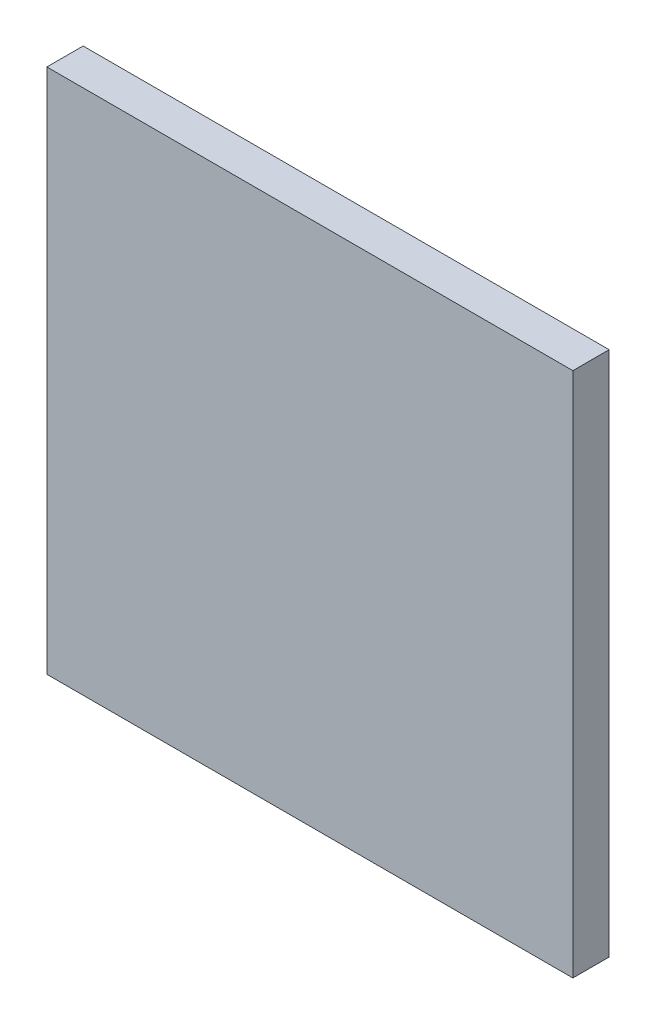
ISO-10303-21;
HEADER;
FILE_DESCRIPTION(('STEP AP214'),'2;1');
FILE_NAME('part.step','',(''),(''),'','','');
FILE_SCHEMA(('AUTOMOTIVE_DESIGN { 1 0 10303 214 1 1 1 1 }'));
ENDSEC;
DATA;
#1=APPLICATION_CONTEXT('core data for automotive mechanical design processes');
#2=APPLICATION_PROTOCOL_DEFINITION('international standard','automotive_design',2000,#1);
#3=PRODUCT_CONTEXT('',#1,'mechanical');
#4=PRODUCT('Part','Part','',(#3));
#5=PRODUCT_RELATED_PRODUCT_CATEGORY('part','',(#4));
#6=PRODUCT_DEFINITION_FORMATION('','',#4);
#7=PRODUCT_DEFINITION_CONTEXT('part definition',#1,'design');
#8=PRODUCT_DEFINITION('design','',#6,#7);
#9=PRODUCT_DEFINITION_SHAPE('','',#8);
#10=(LENGTH_UNIT() NAMED_UNIT(*) SI_UNIT(.MILLI.,.METRE.));
#11=(NAMED_UNIT(*) PLANE_ANGLE_UNIT() SI_UNIT($,.RADIAN.));
#12=(NAMED_UNIT(*) SI_UNIT($,.STERADIAN.) SOLID_ANGLE_UNIT());
#13=UNCERTAINTY_MEASURE_WITH_UNIT(LENGTH_MEASURE(1.E-05),#10,'distance_accuracy_value','');
#14=(GEOMETRIC_REPRESENTATION_CONTEXT(3) GLOBAL_UNCERTAINTY_ASSIGNED_CONTEXT((#13)) GLOBAL_UNIT_ASSIGNED_CONTEXT((#10,
#11,#12)) REPRESENTATION_CONTEXT('',''));
#15=CARTESIAN_POINT('',(0.,0.,0.));
#16=DIRECTION('',(0.,0.,1.));
#17=DIRECTION('',(1.,0.,0.));
#18=AXIS2_PLACEMENT_3D('',#15,#16,#17);
#19=CARTESIAN_POINT('',(0.,0.,1.));
#20=DIRECTION('',(1.,0.,0.));
#21=DIRECTION('',(0.,1.,0.));
#22=AXIS2_PLACEMENT_3D('',#19,#20,#21);
#23=PLANE('',#22);
#24=DIRECTION('',(0.,-1.,0.));
#25=VECTOR('',#24,1.);
#26=CARTESIAN_POINT('',(0.,0.,0.));
#27=LINE('',#26,#25);
#28=CARTESIAN_POINT('',(0.,14.5,0.));
#29=VERTEX_POINT('',#28);
#30=CARTESIAN_POINT('',(0.,0.,0.));
#31=VERTEX_POINT('',#30);
#32=EDGE_CURVE('E107',#29,#31,#27,.T.);
#33=ORIENTED_EDGE('',*,*,#32,.T.);
#34=DIRECTION('',(0.,0.,-1.));
#35=VECTOR('',#34,1.);
#36=CARTESIAN_POINT('',(0.,0.,1.));
#37=LINE('',#36,#35);
#38=CARTESIAN_POINT('',(0.,0.,1.));
#39=VERTEX_POINT('',#38);
#40=EDGE_CURVE('E11',#39,#31,#37,.T.);
#41=ORIENTED_EDGE('',*,*,#40,.F.);
#42=DIRECTION('',(0.,-1.,0.));
#43=VECTOR('',#42,1.);
#44=CARTESIAN_POINT('',(0.,0.,1.));
#45=LINE('',#44,#43);
#46=CARTESIAN_POINT('',(0.,14.5,1.));
#47=VERTEX_POINT('',#46);
#48=EDGE_CURVE('E91',#47,#39,#45,.T.);
#49=ORIENTED_EDGE('',*,*,#48,.F.);
#50=DIRECTION('',(0.,0.,-1.));
#51=VECTOR('',#50,1.);
#52=CARTESIAN_POINT('',(0.,14.5,1.));
#53=LINE('',#52,#51);
#54=EDGE_CURVE('E103',#47,#29,#53,.T.);
#55=ORIENTED_EDGE('',*,*,#54,.T.);
#56=EDGE_LOOP('',(#33,#41,#49,#55));
#57=FACE_BOUND('',#56,.T.);
#58=ADVANCED_FACE('F39',(#57),#23,.F.);
#59=CARTESIAN_POINT('',(0.,0.,1.));
#60=DIRECTION('',(0.,1.,0.));
#61=DIRECTION('',(0.,0.,1.));
#62=AXIS2_PLACEMENT_3D('',#59,#60,#61);
#63=PLANE('',#62);
#64=DIRECTION('',(1.,0.,0.));
#65=VECTOR('',#64,1.);
#66=CARTESIAN_POINT('',(0.,0.,0.));
#67=LINE('',#66,#65);
#68=CARTESIAN_POINT('',(14.5,0.,0.));
#69=VERTEX_POINT('',#68);
#70=EDGE_CURVE('E96',#31,#69,#67,.T.);
#71=ORIENTED_EDGE('',*,*,#70,.T.);
#72=DIRECTION('',(0.,0.,-1.));
#73=VECTOR('',#72,1.);
#74=CARTESIAN_POINT('',(14.5,0.,1.));
#75=LINE('',#74,#73);
#76=CARTESIAN_POINT('',(14.5,0.,1.));
#77=VERTEX_POINT('',#76);
#78=EDGE_CURVE('E48',#77,#69,#75,.T.);
#79=ORIENTED_EDGE('',*,*,#78,.F.);
#80=DIRECTION('',(1.,0.,0.));
#81=VECTOR('',#80,1.);
#82=CARTESIAN_POINT('',(0.,0.,1.));
#83=LINE('',#82,#81);
#84=EDGE_CURVE('E86',#39,#77,#83,.T.);
#85=ORIENTED_EDGE('',*,*,#84,.F.);
#86=ORIENTED_EDGE('',*,*,#40,.T.);
#87=EDGE_LOOP('',(#71,#79,#85,#86));
#88=FACE_BOUND('',#87,.T.);
#89=ADVANCED_FACE('F95',(#88),#63,.F.);
#90=CARTESIAN_POINT('',(14.5,0.,1.));
#91=DIRECTION('',(-1.,0.,0.));
#92=DIRECTION('',(0.,0.,1.));
#93=AXIS2_PLACEMENT_3D('',#90,#91,#92);
#94=PLANE('',#93);
#95=DIRECTION('',(0.,1.,0.));
#96=VECTOR('',#95,1.);
#97=CARTESIAN_POINT('',(14.5,0.,0.));
#98=LINE('',#97,#96);
#99=CARTESIAN_POINT('',(14.5,14.5,0.));
#100=VERTEX_POINT('',#99);
#101=EDGE_CURVE('E73',#69,#100,#98,.T.);
#102=ORIENTED_EDGE('',*,*,#101,.T.);
#103=DIRECTION('',(0.,0.,-1.));
#104=VECTOR('',#103,1.);
#105=CARTESIAN_POINT('',(14.5,14.5,1.));
#106=LINE('',#105,#104);
#107=CARTESIAN_POINT('',(14.5,14.5,1.));
#108=VERTEX_POINT('',#107);
#109=EDGE_CURVE('E98',#108,#100,#106,.T.);
#110=ORIENTED_EDGE('',*,*,#109,.F.);
#111=DIRECTION('',(0.,1.,0.));
#112=VECTOR('',#111,1.);
#113=CARTESIAN_POINT('',(14.5,0.,1.));
#114=LINE('',#113,#112);
#115=EDGE_CURVE('E89',#77,#108,#114,.T.);
#116=ORIENTED_EDGE('',*,*,#115,.F.);
#117=ORIENTED_EDGE('',*,*,#78,.T.);
#118=EDGE_LOOP('',(#102,#110,#116,#117));
#119=FACE_BOUND('',#118,.T.);
#120=ADVANCED_FACE('F99',(#119),#94,.F.);
#121=CARTESIAN_POINT('',(0.,14.5,1.));
#122=DIRECTION('',(0.,-1.,0.));
#123=DIRECTION('',(0.,0.,-1.));
#124=AXIS2_PLACEMENT_3D('',#121,#122,#123);
#125=PLANE('',#124);
#126=DIRECTION('',(-1.,0.,0.));
#127=VECTOR('',#126,1.);
#128=CARTESIAN_POINT('',(0.,14.5,0.));
#129=LINE('',#128,#127);
#130=EDGE_CURVE('E79',#100,#29,#129,.T.);
#131=ORIENTED_EDGE('',*,*,#130,.T.);
#132=ORIENTED_EDGE('',*,*,#54,.F.);
#133=DIRECTION('',(-1.,0.,0.));
#134=VECTOR('',#133,1.);
#135=CARTESIAN_POINT('',(0.,14.5,1.));
#136=LINE('',#135,#134);
#137=EDGE_CURVE('E56',#108,#47,#136,.T.);
#138=ORIENTED_EDGE('',*,*,#137,.F.);
#139=ORIENTED_EDGE('',*,*,#109,.T.);
#140=EDGE_LOOP('',(#131,#132,#138,#139));
#141=FACE_BOUND('',#140,.T.);
#142=ADVANCED_FACE('F120',(#141),#125,.F.);
#143=CARTESIAN_POINT('',(0.,0.,1.));
#144=DIRECTION('',(0.,0.,-1.));
#145=DIRECTION('',(-1.,0.,0.));
#146=AXIS2_PLACEMENT_3D('',#143,#144,#145);
#147=PLANE('',#146);
#148=ORIENTED_EDGE('',*,*,#48,.T.);
#149=ORIENTED_EDGE('',*,*,#84,.T.);
#150=ORIENTED_EDGE('',*,*,#115,.T.);
#151=ORIENTED_EDGE('',*,*,#137,.T.);
#152=EDGE_LOOP('',(#148,#149,#150,#151));
#153=FACE_BOUND('',#152,.T.);
#154=ADVANCED_FACE('F87',(#153),#147,.F.);
#155=CARTESIAN_POINT('',(0.,0.,0.));
#156=DIRECTION('',(0.,0.,-1.));
#157=DIRECTION('',(-1.,0.,0.));
#158=AXIS2_PLACEMENT_3D('',#155,#156,#157);
#159=PLANE('',#158);
#160=ORIENTED_EDGE('',*,*,#32,.F.);
#161=ORIENTED_EDGE('',*,*,#130,.F.);
#162=ORIENTED_EDGE('',*,*,#101,.F.);
#163=ORIENTED_EDGE('',*,*,#70,.F.);
#164=EDGE_LOOP('',(#160,#161,#162,#163));
#165=FACE_BOUND('',#164,.T.);
#166=ADVANCED_FACE('F123',(#165),#159,.T.);
#167=CLOSED_SHELL('',(#58,#89,#120,#142,#154,#166));
#168=MANIFOLD_SOLID_BREP('B2',#167);
#169=ADVANCED_BREP_SHAPE_REPRESENTATION('',(#18,#168),#14);
#170=SHAPE_DEFINITION_REPRESENTATION(#9,#169);
ENDSEC;
END-ISO-10303-21;
